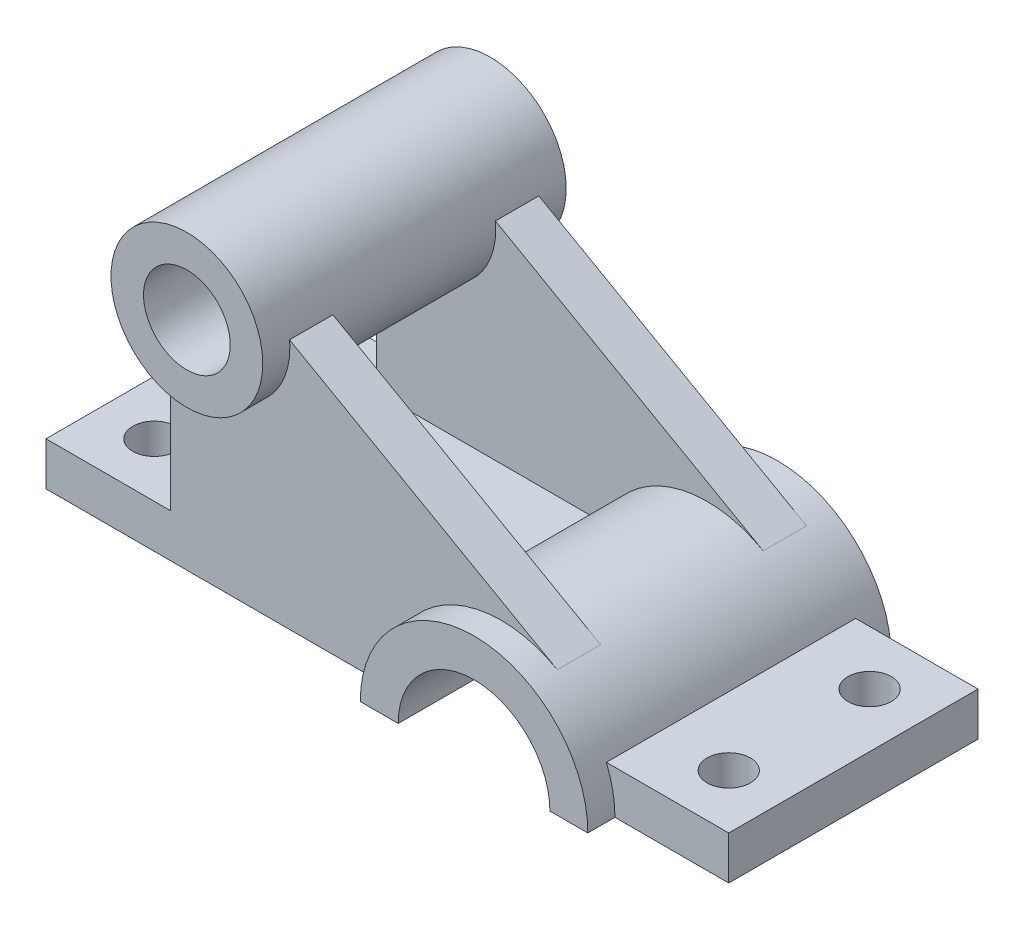
ISO-10303-21;
HEADER;
FILE_DESCRIPTION(('STEP AP214'),'2;1');
FILE_NAME('part.step','',(''),(''),'','','');
FILE_SCHEMA(('AUTOMOTIVE_DESIGN { 1 0 10303 214 1 1 1 1 }'));
ENDSEC;
DATA;
#1=APPLICATION_CONTEXT('core data for automotive mechanical design processes');
#2=APPLICATION_PROTOCOL_DEFINITION('international standard','automotive_design',2000,#1);
#3=PRODUCT_CONTEXT('',#1,'mechanical');
#4=PRODUCT('Part','Part','',(#3));
#5=PRODUCT_RELATED_PRODUCT_CATEGORY('part','',(#4));
#6=PRODUCT_DEFINITION_FORMATION('','',#4);
#7=PRODUCT_DEFINITION_CONTEXT('part definition',#1,'design');
#8=PRODUCT_DEFINITION('design','',#6,#7);
#9=PRODUCT_DEFINITION_SHAPE('','',#8);
#10=(LENGTH_UNIT() NAMED_UNIT(*) SI_UNIT(.MILLI.,.METRE.));
#11=(NAMED_UNIT(*) PLANE_ANGLE_UNIT() SI_UNIT($,.RADIAN.));
#12=(NAMED_UNIT(*) SI_UNIT($,.STERADIAN.) SOLID_ANGLE_UNIT());
#13=UNCERTAINTY_MEASURE_WITH_UNIT(LENGTH_MEASURE(1.E-05),#10,'distance_accuracy_value','');
#14=(GEOMETRIC_REPRESENTATION_CONTEXT(3) GLOBAL_UNCERTAINTY_ASSIGNED_CONTEXT((#13)) GLOBAL_UNIT_ASSIGNED_CONTEXT((#10,
#11,#12)) REPRESENTATION_CONTEXT('',''));
#15=CARTESIAN_POINT('',(0.,0.,0.));
#16=DIRECTION('',(0.,0.,1.));
#17=DIRECTION('',(1.,0.,0.));
#18=AXIS2_PLACEMENT_3D('',#15,#16,#17);
#19=CARTESIAN_POINT('',(-53.,45.,28.));
#20=DIRECTION('',(0.,0.,-1.));
#21=DIRECTION('',(-1.,0.,0.));
#22=AXIS2_PLACEMENT_3D('',#19,#20,#21);
#23=CYLINDRICAL_SURFACE('',#22,14.);
#24=CARTESIAN_POINT('',(-53.,45.,15.));
#25=DIRECTION('',(0.,0.,1.));
#26=DIRECTION('',(1.,0.,0.));
#27=AXIS2_PLACEMENT_3D('',#24,#25,#26);
#28=CIRCLE('',#27,14.);
#29=CARTESIAN_POINT('',(-61.,33.5108747069239,15.));
#30=VERTEX_POINT('',#29);
#31=CARTESIAN_POINT('',(-39.0597014509241,46.291540306236,15.));
#32=VERTEX_POINT('',#31);
#33=EDGE_CURVE('E383',#30,#32,#28,.T.);
#34=ORIENTED_EDGE('',*,*,#33,.F.);
#35=DIRECTION('',(0.,0.,-1.));
#36=VECTOR('',#35,1.);
#37=CARTESIAN_POINT('',(-61.,33.5108747069239,28.));
#38=LINE('',#37,#36);
#39=CARTESIAN_POINT('',(-61.,33.5108747069239,23.));
#40=VERTEX_POINT('',#39);
#41=EDGE_CURVE('E386',#30,#40,#38,.F.);
#42=ORIENTED_EDGE('',*,*,#41,.T.);
#43=CARTESIAN_POINT('',(-53.,45.,23.));
#44=DIRECTION('',(0.,0.,1.));
#45=DIRECTION('',(1.,0.,0.));
#46=AXIS2_PLACEMENT_3D('',#43,#44,#45);
#47=CIRCLE('',#46,14.);
#48=CARTESIAN_POINT('',(-39.0597014509241,46.291540306236,23.));
#49=VERTEX_POINT('',#48);
#50=EDGE_CURVE('E376',#40,#49,#47,.T.);
#51=ORIENTED_EDGE('',*,*,#50,.T.);
#52=DIRECTION('',(0.,0.,-1.));
#53=VECTOR('',#52,1.);
#54=CARTESIAN_POINT('',(-39.0597014509241,46.291540306236,28.));
#55=LINE('',#54,#53);
#56=EDGE_CURVE('E390',#49,#32,#55,.T.);
#57=ORIENTED_EDGE('',*,*,#56,.T.);
#58=EDGE_LOOP('',(#34,#42,#51,#57));
#59=FACE_BOUND('',#58,.T.);
#60=CARTESIAN_POINT('',(-53.,45.,28.));
#61=DIRECTION('',(0.,0.,1.));
#62=DIRECTION('',(1.,0.,0.));
#63=AXIS2_PLACEMENT_3D('',#60,#61,#62);
#64=CIRCLE('',#63,14.);
#65=CARTESIAN_POINT('',(-39.,45.,28.));
#66=VERTEX_POINT('',#65);
#67=EDGE_CURVE('E11',#66,#66,#64,.T.);
#68=ORIENTED_EDGE('',*,*,#67,.F.);
#69=EDGE_LOOP('',(#68));
#70=FACE_BOUND('',#69,.T.);
#71=CARTESIAN_POINT('',(-53.,45.,-28.));
#72=DIRECTION('',(0.,0.,1.));
#73=DIRECTION('',(1.,0.,0.));
#74=AXIS2_PLACEMENT_3D('',#71,#72,#73);
#75=CIRCLE('',#74,14.);
#76=CARTESIAN_POINT('',(-39.,45.,-28.));
#77=VERTEX_POINT('',#76);
#78=EDGE_CURVE('E48',#77,#77,#75,.T.);
#79=ORIENTED_EDGE('',*,*,#78,.T.);
#80=EDGE_LOOP('',(#79));
#81=FACE_BOUND('',#80,.T.);
#82=CARTESIAN_POINT('',(-53.,45.,-15.));
#83=DIRECTION('',(0.,0.,-1.));
#84=DIRECTION('',(-1.,0.,0.));
#85=AXIS2_PLACEMENT_3D('',#82,#83,#84);
#86=CIRCLE('',#85,14.);
#87=CARTESIAN_POINT('',(-39.0597014509241,46.291540306236,-15.));
#88=VERTEX_POINT('',#87);
#89=CARTESIAN_POINT('',(-61.,33.5108747069239,-15.));
#90=VERTEX_POINT('',#89);
#91=EDGE_CURVE('E227',#88,#90,#86,.T.);
#92=ORIENTED_EDGE('',*,*,#91,.F.);
#93=DIRECTION('',(0.,0.,-1.));
#94=VECTOR('',#93,1.);
#95=CARTESIAN_POINT('',(-39.0597014509241,46.291540306236,28.));
#96=LINE('',#95,#94);
#97=CARTESIAN_POINT('',(-39.0597014509241,46.291540306236,-23.));
#98=VERTEX_POINT('',#97);
#99=EDGE_CURVE('E232',#98,#88,#96,.F.);
#100=ORIENTED_EDGE('',*,*,#99,.F.);
#101=CARTESIAN_POINT('',(-53.,45.,-23.));
#102=DIRECTION('',(0.,0.,-1.));
#103=DIRECTION('',(-1.,0.,0.));
#104=AXIS2_PLACEMENT_3D('',#101,#102,#103);
#105=CIRCLE('',#104,14.);
#106=CARTESIAN_POINT('',(-61.,33.5108747069239,-23.));
#107=VERTEX_POINT('',#106);
#108=EDGE_CURVE('E202',#98,#107,#105,.T.);
#109=ORIENTED_EDGE('',*,*,#108,.T.);
#110=DIRECTION('',(0.,0.,-1.));
#111=VECTOR('',#110,1.);
#112=CARTESIAN_POINT('',(-61.,33.5108747069239,28.));
#113=LINE('',#112,#111);
#114=EDGE_CURVE('E206',#90,#107,#113,.T.);
#115=ORIENTED_EDGE('',*,*,#114,.F.);
#116=EDGE_LOOP('',(#92,#100,#109,#115));
#117=FACE_BOUND('',#116,.T.);
#118=ADVANCED_FACE('F45',(#59,#70,#81,#117),#23,.T.);
#119=CARTESIAN_POINT('',(0.,0.,28.));
#120=DIRECTION('',(0.,0.,-1.));
#121=DIRECTION('',(-1.,0.,0.));
#122=AXIS2_PLACEMENT_3D('',#119,#120,#121);
#123=CYLINDRICAL_SURFACE('',#122,21.);
#124=CARTESIAN_POINT('',(0.,0.,-15.));
#125=DIRECTION('',(0.,0.,-1.));
#126=DIRECTION('',(1.,0.,0.));
#127=AXIS2_PLACEMENT_3D('',#124,#125,#126);
#128=CIRCLE('',#127,21.);
#129=CARTESIAN_POINT('',(-19.4164878389476,7.99999999999999,-15.));
#130=VERTEX_POINT('',#129);
#131=CARTESIAN_POINT('',(10.3589699992719,18.2672313324758,-15.));
#132=VERTEX_POINT('',#131);
#133=EDGE_CURVE('E215',#130,#132,#128,.T.);
#134=ORIENTED_EDGE('',*,*,#133,.F.);
#135=DIRECTION('',(0.,0.,-1.));
#136=VECTOR('',#135,1.);
#137=CARTESIAN_POINT('',(-19.4164878389476,7.99999999999999,28.));
#138=LINE('',#137,#136);
#139=CARTESIAN_POINT('',(-19.4164878389476,7.99999999999999,15.));
#140=VERTEX_POINT('',#139);
#141=EDGE_CURVE('E333',#140,#130,#138,.T.);
#142=ORIENTED_EDGE('',*,*,#141,.F.);
#143=CARTESIAN_POINT('',(0.,0.,15.));
#144=DIRECTION('',(0.,0.,-1.));
#145=DIRECTION('',(1.,0.,0.));
#146=AXIS2_PLACEMENT_3D('',#143,#144,#145);
#147=CIRCLE('',#146,21.);
#148=CARTESIAN_POINT('',(10.3589699992719,18.2672313324758,15.));
#149=VERTEX_POINT('',#148);
#150=EDGE_CURVE('E356',#140,#149,#147,.T.);
#151=ORIENTED_EDGE('',*,*,#150,.T.);
#152=DIRECTION('',(0.,0.,1.));
#153=VECTOR('',#152,1.);
#154=CARTESIAN_POINT('',(10.3589699992719,18.2672313324758,15.));
#155=LINE('',#154,#153);
#156=CARTESIAN_POINT('',(10.3589699992719,18.2672313324758,23.));
#157=VERTEX_POINT('',#156);
#158=EDGE_CURVE('E373',#149,#157,#155,.T.);
#159=ORIENTED_EDGE('',*,*,#158,.T.);
#160=CARTESIAN_POINT('',(0.,0.,23.));
#161=DIRECTION('',(0.,0.,-1.));
#162=DIRECTION('',(1.,0.,0.));
#163=AXIS2_PLACEMENT_3D('',#160,#161,#162);
#164=CIRCLE('',#163,21.);
#165=CARTESIAN_POINT('',(-21.,0.,23.));
#166=VERTEX_POINT('',#165);
#167=EDGE_CURVE('E367',#166,#157,#164,.T.);
#168=ORIENTED_EDGE('',*,*,#167,.F.);
#169=DIRECTION('',(0.,0.,-1.));
#170=VECTOR('',#169,1.);
#171=CARTESIAN_POINT('',(-21.,0.,28.));
#172=LINE('',#171,#170);
#173=CARTESIAN_POINT('',(-21.,0.,28.));
#174=VERTEX_POINT('',#173);
#175=EDGE_CURVE('E322',#174,#166,#172,.T.);
#176=ORIENTED_EDGE('',*,*,#175,.F.);
#177=CARTESIAN_POINT('',(0.,0.,28.));
#178=DIRECTION('',(0.,0.,1.));
#179=DIRECTION('',(1.,0.,0.));
#180=AXIS2_PLACEMENT_3D('',#177,#178,#179);
#181=CIRCLE('',#180,21.);
#182=CARTESIAN_POINT('',(21.,0.,28.));
#183=VERTEX_POINT('',#182);
#184=EDGE_CURVE('E298',#183,#174,#181,.T.);
#185=ORIENTED_EDGE('',*,*,#184,.F.);
#186=DIRECTION('',(0.,0.,-1.));
#187=VECTOR('',#186,1.);
#188=CARTESIAN_POINT('',(21.,0.,28.));
#189=LINE('',#188,#187);
#190=CARTESIAN_POINT('',(21.,0.,23.));
#191=VERTEX_POINT('',#190);
#192=EDGE_CURVE('E327',#183,#191,#189,.T.);
#193=ORIENTED_EDGE('',*,*,#192,.T.);
#194=CARTESIAN_POINT('',(0.,0.,23.));
#195=DIRECTION('',(0.,0.,1.));
#196=DIRECTION('',(1.,0.,0.));
#197=AXIS2_PLACEMENT_3D('',#194,#195,#196);
#198=CIRCLE('',#197,21.);
#199=CARTESIAN_POINT('',(19.4164878389476,8.,23.));
#200=VERTEX_POINT('',#199);
#201=EDGE_CURVE('E344',#191,#200,#198,.T.);
#202=ORIENTED_EDGE('',*,*,#201,.T.);
#203=DIRECTION('',(0.,0.,-1.));
#204=VECTOR('',#203,1.);
#205=CARTESIAN_POINT('',(19.4164878389476,8.,28.));
#206=LINE('',#205,#204);
#207=CARTESIAN_POINT('',(19.4164878389476,8.,-23.));
#208=VERTEX_POINT('',#207);
#209=EDGE_CURVE('E340',#208,#200,#206,.F.);
#210=ORIENTED_EDGE('',*,*,#209,.F.);
#211=CARTESIAN_POINT('',(0.,0.,-23.));
#212=DIRECTION('',(0.,0.,1.));
#213=DIRECTION('',(1.,0.,0.));
#214=AXIS2_PLACEMENT_3D('',#211,#212,#213);
#215=CIRCLE('',#214,21.);
#216=CARTESIAN_POINT('',(21.,0.,-23.));
#217=VERTEX_POINT('',#216);
#218=EDGE_CURVE('E336',#217,#208,#215,.T.);
#219=ORIENTED_EDGE('',*,*,#218,.F.);
#220=CARTESIAN_POINT('',(21.,0.,-28.));
#221=VERTEX_POINT('',#220);
#222=EDGE_CURVE('E326',#217,#221,#189,.T.);
#223=ORIENTED_EDGE('',*,*,#222,.T.);
#224=CARTESIAN_POINT('',(0.,0.,-28.));
#225=DIRECTION('',(0.,0.,1.));
#226=DIRECTION('',(1.,0.,0.));
#227=AXIS2_PLACEMENT_3D('',#224,#225,#226);
#228=CIRCLE('',#227,21.);
#229=CARTESIAN_POINT('',(-21.,0.,-28.));
#230=VERTEX_POINT('',#229);
#231=EDGE_CURVE('E312',#221,#230,#228,.T.);
#232=ORIENTED_EDGE('',*,*,#231,.T.);
#233=CARTESIAN_POINT('',(-21.,0.,-23.));
#234=VERTEX_POINT('',#233);
#235=EDGE_CURVE('E321',#234,#230,#172,.T.);
#236=ORIENTED_EDGE('',*,*,#235,.F.);
#237=CARTESIAN_POINT('',(0.,0.,-23.));
#238=DIRECTION('',(0.,0.,1.));
#239=DIRECTION('',(1.,0.,0.));
#240=AXIS2_PLACEMENT_3D('',#237,#238,#239);
#241=CIRCLE('',#240,21.);
#242=CARTESIAN_POINT('',(10.3589699992719,18.2672313324758,-23.));
#243=VERTEX_POINT('',#242);
#244=EDGE_CURVE('E261',#243,#234,#241,.T.);
#245=ORIENTED_EDGE('',*,*,#244,.F.);
#246=DIRECTION('',(0.,0.,-1.));
#247=VECTOR('',#246,1.);
#248=CARTESIAN_POINT('',(10.3589699992719,18.2672313324758,-15.));
#249=LINE('',#248,#247);
#250=EDGE_CURVE('E68',#132,#243,#249,.T.);
#251=ORIENTED_EDGE('',*,*,#250,.F.);
#252=EDGE_LOOP('',(#134,#142,#151,#159,#168,#176,#185,#193,#202,#210,#219,#223,#232,#236,#245,#251));
#253=FACE_BOUND('',#252,.T.);
#254=ADVANCED_FACE('F424',(#253),#123,.T.);
#255=CARTESIAN_POINT('',(-11.4891252930761,7.99999999999999,23.));
#256=DIRECTION('',(0.,-1.,0.));
#257=DIRECTION('',(1.,0.,0.));
#258=AXIS2_PLACEMENT_3D('',#255,#256,#257);
#259=PLANE('',#258);
#260=CARTESIAN_POINT('',(-74.,7.99999999999999,13.));
#261=DIRECTION('',(0.,1.,0.));
#262=DIRECTION('',(0.,0.,1.));
#263=AXIS2_PLACEMENT_3D('',#260,#261,#262);
#264=CIRCLE('',#263,4.00000000000002);
#265=CARTESIAN_POINT('',(-74.,7.99999999999999,17.));
#266=VERTEX_POINT('',#265);
#267=EDGE_CURVE('E475',#266,#266,#264,.T.);
#268=ORIENTED_EDGE('',*,*,#267,.F.);
#269=EDGE_LOOP('',(#268));
#270=FACE_BOUND('',#269,.T.);
#271=CARTESIAN_POINT('',(-74.,7.99999999999999,-13.));
#272=DIRECTION('',(0.,1.,0.));
#273=DIRECTION('',(0.,0.,1.));
#274=AXIS2_PLACEMENT_3D('',#271,#272,#273);
#275=CIRCLE('',#274,4.00000000000002);
#276=CARTESIAN_POINT('',(-74.,7.99999999999999,-8.99999999999997));
#277=VERTEX_POINT('',#276);
#278=EDGE_CURVE('E467',#277,#277,#275,.T.);
#279=ORIENTED_EDGE('',*,*,#278,.F.);
#280=EDGE_LOOP('',(#279));
#281=FACE_BOUND('',#280,.T.);
#282=DIRECTION('',(0.,0.,-1.));
#283=VECTOR('',#282,1.);
#284=CARTESIAN_POINT('',(-61.,7.99999999999999,-15.));
#285=LINE('',#284,#283);
#286=CARTESIAN_POINT('',(-61.,7.99999999999999,-15.));
#287=VERTEX_POINT('',#286);
#288=CARTESIAN_POINT('',(-61.,7.99999999999999,-23.));
#289=VERTEX_POINT('',#288);
#290=EDGE_CURVE('E193',#287,#289,#285,.T.);
#291=ORIENTED_EDGE('',*,*,#290,.T.);
#292=DIRECTION('',(-1.,0.,0.));
#293=VECTOR('',#292,1.);
#294=CARTESIAN_POINT('',(-11.4891252930761,7.99999999999999,-23.));
#295=LINE('',#294,#293);
#296=CARTESIAN_POINT('',(-84.,7.99999999999998,-23.));
#297=VERTEX_POINT('',#296);
#298=EDGE_CURVE('E180',#289,#297,#295,.T.);
#299=ORIENTED_EDGE('',*,*,#298,.T.);
#300=DIRECTION('',(0.,0.,-1.));
#301=VECTOR('',#300,1.);
#302=CARTESIAN_POINT('',(-84.,7.99999999999998,23.));
#303=LINE('',#302,#301);
#304=CARTESIAN_POINT('',(-84.,7.99999999999998,23.));
#305=VERTEX_POINT('',#304);
#306=EDGE_CURVE('E268',#305,#297,#303,.T.);
#307=ORIENTED_EDGE('',*,*,#306,.F.);
#308=DIRECTION('',(-1.,0.,0.));
#309=VECTOR('',#308,1.);
#310=CARTESIAN_POINT('',(-11.4891252930761,7.99999999999999,23.));
#311=LINE('',#310,#309);
#312=CARTESIAN_POINT('',(-61.,7.99999999999999,23.));
#313=VERTEX_POINT('',#312);
#314=EDGE_CURVE('E270',#313,#305,#311,.T.);
#315=ORIENTED_EDGE('',*,*,#314,.F.);
#316=DIRECTION('',(0.,0.,1.));
#317=VECTOR('',#316,1.);
#318=CARTESIAN_POINT('',(-61.,7.99999999999999,15.));
#319=LINE('',#318,#317);
#320=CARTESIAN_POINT('',(-61.,7.99999999999999,15.));
#321=VERTEX_POINT('',#320);
#322=EDGE_CURVE('E363',#321,#313,#319,.T.);
#323=ORIENTED_EDGE('',*,*,#322,.F.);
#324=DIRECTION('',(1.,0.,0.));
#325=VECTOR('',#324,1.);
#326=CARTESIAN_POINT('',(-19.4164878389476,7.99999999999999,15.));
#327=LINE('',#326,#325);
#328=EDGE_CURVE('E352',#321,#140,#327,.T.);
#329=ORIENTED_EDGE('',*,*,#328,.T.);
#330=ORIENTED_EDGE('',*,*,#141,.T.);
#331=DIRECTION('',(1.,0.,0.));
#332=VECTOR('',#331,1.);
#333=CARTESIAN_POINT('',(-19.4164878389476,7.99999999999999,-15.));
#334=LINE('',#333,#332);
#335=EDGE_CURVE('E197',#287,#130,#334,.T.);
#336=ORIENTED_EDGE('',*,*,#335,.F.);
#337=EDGE_LOOP('',(#291,#299,#307,#315,#323,#329,#330,#336));
#338=FACE_BOUND('',#337,.T.);
#339=ADVANCED_FACE('F194',(#270,#281,#338),#259,.F.);
#340=CARTESIAN_POINT('',(-53.,45.,28.));
#341=DIRECTION('',(0.,0.,1.));
#342=DIRECTION('',(1.,0.,0.));
#343=AXIS2_PLACEMENT_3D('',#340,#341,#342);
#344=PLANE('',#343);
#345=ORIENTED_EDGE('',*,*,#67,.T.);
#346=EDGE_LOOP('',(#345));
#347=FACE_BOUND('',#346,.T.);
#348=CARTESIAN_POINT('',(-53.,45.,28.));
#349=DIRECTION('',(0.,0.,1.));
#350=DIRECTION('',(1.,0.,0.));
#351=AXIS2_PLACEMENT_3D('',#348,#349,#350);
#352=CIRCLE('',#351,8.);
#353=CARTESIAN_POINT('',(-45.,45.,28.));
#354=VERTEX_POINT('',#353);
#355=EDGE_CURVE('E395',#354,#354,#352,.T.);
#356=ORIENTED_EDGE('',*,*,#355,.F.);
#357=EDGE_LOOP('',(#356));
#358=FACE_BOUND('',#357,.T.);
#359=ADVANCED_FACE('F419',(#347,#358),#344,.T.);
#360=CARTESIAN_POINT('',(-53.,45.,-28.));
#361=DIRECTION('',(0.,0.,1.));
#362=DIRECTION('',(1.,0.,0.));
#363=AXIS2_PLACEMENT_3D('',#360,#361,#362);
#364=PLANE('',#363);
#365=ORIENTED_EDGE('',*,*,#78,.F.);
#366=EDGE_LOOP('',(#365));
#367=FACE_BOUND('',#366,.T.);
#368=CARTESIAN_POINT('',(-53.,45.,-28.));
#369=DIRECTION('',(0.,0.,1.));
#370=DIRECTION('',(1.,0.,0.));
#371=AXIS2_PLACEMENT_3D('',#368,#369,#370);
#372=CIRCLE('',#371,8.);
#373=CARTESIAN_POINT('',(-45.,45.,-28.));
#374=VERTEX_POINT('',#373);
#375=EDGE_CURVE('E394',#374,#374,#372,.T.);
#376=ORIENTED_EDGE('',*,*,#375,.T.);
#377=EDGE_LOOP('',(#376));
#378=FACE_BOUND('',#377,.T.);
#379=ADVANCED_FACE('F403',(#367,#378),#364,.F.);
#380=CARTESIAN_POINT('',(-53.,45.,28.));
#381=DIRECTION('',(0.,0.,-1.));
#382=DIRECTION('',(-1.,0.,0.));
#383=AXIS2_PLACEMENT_3D('',#380,#381,#382);
#384=CYLINDRICAL_SURFACE('',#383,8.);
#385=ORIENTED_EDGE('',*,*,#355,.T.);
#386=EDGE_LOOP('',(#385));
#387=FACE_BOUND('',#386,.T.);
#388=ORIENTED_EDGE('',*,*,#375,.F.);
#389=EDGE_LOOP('',(#388));
#390=FACE_BOUND('',#389,.T.);
#391=ADVANCED_FACE('F405',(#387,#390),#384,.F.);
#392=CARTESIAN_POINT('',(-49.0537257145631,51.9589452695146,15.));
#393=DIRECTION('',(0.493284285679614,0.869868158689323,0.));
#394=DIRECTION('',(-0.869868158689323,0.493284285679614,0.));
#395=AXIS2_PLACEMENT_3D('',#392,#393,#394);
#396=PLANE('',#395);
#397=ORIENTED_EDGE('',*,*,#56,.F.);
#398=DIRECTION('',(-0.869868158689323,0.493284285679614,0.));
#399=VECTOR('',#398,1.);
#400=CARTESIAN_POINT('',(-49.0537257145631,51.9589452695146,23.));
#401=LINE('',#400,#399);
#402=EDGE_CURVE('E353',#157,#49,#401,.T.);
#403=ORIENTED_EDGE('',*,*,#402,.F.);
#404=ORIENTED_EDGE('',*,*,#158,.F.);
#405=DIRECTION('',(-0.869868158689323,0.493284285679614,0.));
#406=VECTOR('',#405,1.);
#407=CARTESIAN_POINT('',(-49.0537257145631,51.9589452695146,15.));
#408=LINE('',#407,#406);
#409=EDGE_CURVE('E359',#149,#32,#408,.T.);
#410=ORIENTED_EDGE('',*,*,#409,.T.);
#411=EDGE_LOOP('',(#397,#403,#404,#410));
#412=FACE_BOUND('',#411,.T.);
#413=ADVANCED_FACE('F407',(#412),#396,.T.);
#414=CARTESIAN_POINT('',(-61.,45.,15.));
#415=DIRECTION('',(-1.,0.,0.));
#416=DIRECTION('',(0.,0.,1.));
#417=AXIS2_PLACEMENT_3D('',#414,#415,#416);
#418=PLANE('',#417);
#419=ORIENTED_EDGE('',*,*,#41,.F.);
#420=DIRECTION('',(0.,-1.,0.));
#421=VECTOR('',#420,1.);
#422=CARTESIAN_POINT('',(-61.,45.,15.));
#423=LINE('',#422,#421);
#424=EDGE_CURVE('E348',#30,#321,#423,.T.);
#425=ORIENTED_EDGE('',*,*,#424,.T.);
#426=ORIENTED_EDGE('',*,*,#322,.T.);
#427=DIRECTION('',(0.,-1.,0.));
#428=VECTOR('',#427,1.);
#429=CARTESIAN_POINT('',(-61.,45.,23.));
#430=LINE('',#429,#428);
#431=EDGE_CURVE('E347',#40,#313,#430,.T.);
#432=ORIENTED_EDGE('',*,*,#431,.F.);
#433=EDGE_LOOP('',(#419,#425,#426,#432));
#434=FACE_BOUND('',#433,.T.);
#435=ADVANCED_FACE('F415',(#434),#418,.T.);
#436=CARTESIAN_POINT('',(-53.,45.,15.));
#437=DIRECTION('',(0.,0.,1.));
#438=DIRECTION('',(1.,0.,0.));
#439=AXIS2_PLACEMENT_3D('',#436,#437,#438);
#440=PLANE('',#439);
#441=ORIENTED_EDGE('',*,*,#424,.F.);
#442=ORIENTED_EDGE('',*,*,#33,.T.);
#443=ORIENTED_EDGE('',*,*,#409,.F.);
#444=ORIENTED_EDGE('',*,*,#150,.F.);
#445=ORIENTED_EDGE('',*,*,#328,.F.);
#446=EDGE_LOOP('',(#441,#442,#443,#444,#445));
#447=FACE_BOUND('',#446,.T.);
#448=ADVANCED_FACE('F555',(#447),#440,.F.);
#449=CARTESIAN_POINT('',(-53.,45.,23.));
#450=DIRECTION('',(0.,0.,1.));
#451=DIRECTION('',(1.,0.,0.));
#452=AXIS2_PLACEMENT_3D('',#449,#450,#451);
#453=PLANE('',#452);
#454=ORIENTED_EDGE('',*,*,#50,.F.);
#455=ORIENTED_EDGE('',*,*,#431,.T.);
#456=ORIENTED_EDGE('',*,*,#314,.T.);
#457=DIRECTION('',(0.,-1.,0.));
#458=VECTOR('',#457,1.);
#459=CARTESIAN_POINT('',(-84.,7.99999999999998,23.));
#460=LINE('',#459,#458);
#461=CARTESIAN_POINT('',(-84.,0.,23.));
#462=VERTEX_POINT('',#461);
#463=EDGE_CURVE('E190',#305,#462,#460,.T.);
#464=ORIENTED_EDGE('',*,*,#463,.T.);
#465=DIRECTION('',(1.,0.,0.));
#466=VECTOR('',#465,1.);
#467=CARTESIAN_POINT('',(-84.,0.,23.));
#468=LINE('',#467,#466);
#469=EDGE_CURVE('E279',#462,#166,#468,.T.);
#470=ORIENTED_EDGE('',*,*,#469,.T.);
#471=ORIENTED_EDGE('',*,*,#167,.T.);
#472=ORIENTED_EDGE('',*,*,#402,.T.);
#473=EDGE_LOOP('',(#454,#455,#456,#464,#470,#471,#472));
#474=FACE_BOUND('',#473,.T.);
#475=ADVANCED_FACE('F553',(#474),#453,.T.);
#476=CARTESIAN_POINT('',(0.,0.,28.));
#477=DIRECTION('',(0.,0.,-1.));
#478=DIRECTION('',(-1.,0.,0.));
#479=AXIS2_PLACEMENT_3D('',#476,#477,#478);
#480=CYLINDRICAL_SURFACE('',#479,14.);
#481=CARTESIAN_POINT('',(0.,0.,-28.));
#482=DIRECTION('',(0.,0.,-1.));
#483=DIRECTION('',(1.,0.,0.));
#484=AXIS2_PLACEMENT_3D('',#481,#482,#483);
#485=CIRCLE('',#484,14.);
#486=CARTESIAN_POINT('',(-14.,0.,-28.));
#487=VERTEX_POINT('',#486);
#488=CARTESIAN_POINT('',(14.,0.,-28.));
#489=VERTEX_POINT('',#488);
#490=EDGE_CURVE('E289',#487,#489,#485,.T.);
#491=ORIENTED_EDGE('',*,*,#490,.T.);
#492=DIRECTION('',(0.,0.,-1.));
#493=VECTOR('',#492,1.);
#494=CARTESIAN_POINT('',(14.,0.,28.));
#495=LINE('',#494,#493);
#496=CARTESIAN_POINT('',(14.,0.,28.));
#497=VERTEX_POINT('',#496);
#498=EDGE_CURVE('E330',#497,#489,#495,.T.);
#499=ORIENTED_EDGE('',*,*,#498,.F.);
#500=CARTESIAN_POINT('',(0.,0.,28.));
#501=DIRECTION('',(0.,0.,-1.));
#502=DIRECTION('',(1.,0.,0.));
#503=AXIS2_PLACEMENT_3D('',#500,#501,#502);
#504=CIRCLE('',#503,14.);
#505=CARTESIAN_POINT('',(-14.,0.,28.));
#506=VERTEX_POINT('',#505);
#507=EDGE_CURVE('E290',#506,#497,#504,.T.);
#508=ORIENTED_EDGE('',*,*,#507,.F.);
#509=DIRECTION('',(0.,0.,-1.));
#510=VECTOR('',#509,1.);
#511=CARTESIAN_POINT('',(-14.,0.,28.));
#512=LINE('',#511,#510);
#513=EDGE_CURVE('E304',#506,#487,#512,.T.);
#514=ORIENTED_EDGE('',*,*,#513,.T.);
#515=EDGE_LOOP('',(#491,#499,#508,#514));
#516=FACE_BOUND('',#515,.T.);
#517=ADVANCED_FACE('F549',(#516),#480,.F.);
#518=CARTESIAN_POINT('',(14.,0.,28.));
#519=DIRECTION('',(0.,1.,0.));
#520=DIRECTION('',(0.,0.,1.));
#521=AXIS2_PLACEMENT_3D('',#518,#519,#520);
#522=PLANE('',#521);
#523=CARTESIAN_POINT('',(32.,0.,-13.));
#524=DIRECTION('',(0.,1.,0.));
#525=DIRECTION('',(0.,0.,1.));
#526=AXIS2_PLACEMENT_3D('',#523,#524,#525);
#527=CIRCLE('',#526,4.00000000000002);
#528=CARTESIAN_POINT('',(32.,0.,-8.99999999999998));
#529=VERTEX_POINT('',#528);
#530=EDGE_CURVE('E455',#529,#529,#527,.T.);
#531=ORIENTED_EDGE('',*,*,#530,.T.);
#532=EDGE_LOOP('',(#531));
#533=FACE_BOUND('',#532,.T.);
#534=CARTESIAN_POINT('',(32.,0.,13.));
#535=DIRECTION('',(0.,1.,0.));
#536=DIRECTION('',(0.,0.,1.));
#537=AXIS2_PLACEMENT_3D('',#534,#535,#536);
#538=CIRCLE('',#537,4.00000000000002);
#539=CARTESIAN_POINT('',(32.,0.,17.));
#540=VERTEX_POINT('',#539);
#541=EDGE_CURVE('E218',#540,#540,#538,.T.);
#542=ORIENTED_EDGE('',*,*,#541,.T.);
#543=EDGE_LOOP('',(#542));
#544=FACE_BOUND('',#543,.T.);
#545=ORIENTED_EDGE('',*,*,#498,.T.);
#546=DIRECTION('',(1.,0.,0.));
#547=VECTOR('',#546,1.);
#548=CARTESIAN_POINT('',(14.,0.,-28.));
#549=LINE('',#548,#547);
#550=EDGE_CURVE('E308',#489,#221,#549,.T.);
#551=ORIENTED_EDGE('',*,*,#550,.T.);
#552=ORIENTED_EDGE('',*,*,#222,.F.);
#553=DIRECTION('',(1.,0.,0.));
#554=VECTOR('',#553,1.);
#555=CARTESIAN_POINT('',(14.,0.,-23.));
#556=LINE('',#555,#554);
#557=CARTESIAN_POINT('',(42.,0.,-23.));
#558=VERTEX_POINT('',#557);
#559=EDGE_CURVE('E241',#217,#558,#556,.T.);
#560=ORIENTED_EDGE('',*,*,#559,.T.);
#561=DIRECTION('',(0.,0.,-1.));
#562=VECTOR('',#561,1.);
#563=CARTESIAN_POINT('',(42.,0.,23.));
#564=LINE('',#563,#562);
#565=CARTESIAN_POINT('',(42.,0.,23.));
#566=VERTEX_POINT('',#565);
#567=EDGE_CURVE('E257',#566,#558,#564,.T.);
#568=ORIENTED_EDGE('',*,*,#567,.F.);
#569=DIRECTION('',(1.,0.,0.));
#570=VECTOR('',#569,1.);
#571=CARTESIAN_POINT('',(14.,0.,23.));
#572=LINE('',#571,#570);
#573=EDGE_CURVE('E244',#191,#566,#572,.T.);
#574=ORIENTED_EDGE('',*,*,#573,.F.);
#575=ORIENTED_EDGE('',*,*,#192,.F.);
#576=DIRECTION('',(1.,0.,0.));
#577=VECTOR('',#576,1.);
#578=CARTESIAN_POINT('',(14.,0.,28.));
#579=LINE('',#578,#577);
#580=EDGE_CURVE('E294',#497,#183,#579,.T.);
#581=ORIENTED_EDGE('',*,*,#580,.F.);
#582=EDGE_LOOP('',(#545,#551,#552,#560,#568,#574,#575,#581));
#583=FACE_BOUND('',#582,.T.);
#584=ADVANCED_FACE('F544',(#533,#544,#583),#522,.F.);
#585=CARTESIAN_POINT('',(-21.,0.,28.));
#586=DIRECTION('',(0.,1.,0.));
#587=DIRECTION('',(0.,0.,1.));
#588=AXIS2_PLACEMENT_3D('',#585,#586,#587);
#589=PLANE('',#588);
#590=CARTESIAN_POINT('',(-74.,0.,13.));
#591=DIRECTION('',(0.,1.,0.));
#592=DIRECTION('',(0.,0.,1.));
#593=AXIS2_PLACEMENT_3D('',#590,#591,#592);
#594=CIRCLE('',#593,4.00000000000002);
#595=CARTESIAN_POINT('',(-74.,0.,17.));
#596=VERTEX_POINT('',#595);
#597=EDGE_CURVE('E471',#596,#596,#594,.T.);
#598=ORIENTED_EDGE('',*,*,#597,.T.);
#599=EDGE_LOOP('',(#598));
#600=FACE_BOUND('',#599,.T.);
#601=CARTESIAN_POINT('',(-74.,0.,-13.));
#602=DIRECTION('',(0.,1.,0.));
#603=DIRECTION('',(0.,0.,1.));
#604=AXIS2_PLACEMENT_3D('',#601,#602,#603);
#605=CIRCLE('',#604,4.00000000000002);
#606=CARTESIAN_POINT('',(-74.,0.,-8.99999999999997));
#607=VERTEX_POINT('',#606);
#608=EDGE_CURVE('E463',#607,#607,#605,.T.);
#609=ORIENTED_EDGE('',*,*,#608,.T.);
#610=EDGE_LOOP('',(#609));
#611=FACE_BOUND('',#610,.T.);
#612=ORIENTED_EDGE('',*,*,#175,.T.);
#613=ORIENTED_EDGE('',*,*,#469,.F.);
#614=DIRECTION('',(0.,0.,-1.));
#615=VECTOR('',#614,1.);
#616=CARTESIAN_POINT('',(-84.,0.,23.));
#617=LINE('',#616,#615);
#618=CARTESIAN_POINT('',(-84.,0.,-23.));
#619=VERTEX_POINT('',#618);
#620=EDGE_CURVE('E235',#462,#619,#617,.T.);
#621=ORIENTED_EDGE('',*,*,#620,.T.);
#622=DIRECTION('',(1.,0.,0.));
#623=VECTOR('',#622,1.);
#624=CARTESIAN_POINT('',(-84.,0.,-23.));
#625=LINE('',#624,#623);
#626=EDGE_CURVE('E189',#619,#234,#625,.T.);
#627=ORIENTED_EDGE('',*,*,#626,.T.);
#628=ORIENTED_EDGE('',*,*,#235,.T.);
#629=DIRECTION('',(1.,0.,0.));
#630=VECTOR('',#629,1.);
#631=CARTESIAN_POINT('',(-21.,0.,-28.));
#632=LINE('',#631,#630);
#633=EDGE_CURVE('E295',#230,#487,#632,.T.);
#634=ORIENTED_EDGE('',*,*,#633,.T.);
#635=ORIENTED_EDGE('',*,*,#513,.F.);
#636=DIRECTION('',(1.,0.,0.));
#637=VECTOR('',#636,1.);
#638=CARTESIAN_POINT('',(-21.,0.,28.));
#639=LINE('',#638,#637);
#640=EDGE_CURVE('E301',#174,#506,#639,.T.);
#641=ORIENTED_EDGE('',*,*,#640,.F.);
#642=EDGE_LOOP('',(#612,#613,#621,#627,#628,#634,#635,#641));
#643=FACE_BOUND('',#642,.T.);
#644=ADVANCED_FACE('F539',(#600,#611,#643),#589,.F.);
#645=CARTESIAN_POINT('',(0.,0.,28.));
#646=DIRECTION('',(0.,0.,1.));
#647=DIRECTION('',(1.,0.,0.));
#648=AXIS2_PLACEMENT_3D('',#645,#646,#647);
#649=PLANE('',#648);
#650=ORIENTED_EDGE('',*,*,#507,.T.);
#651=ORIENTED_EDGE('',*,*,#580,.T.);
#652=ORIENTED_EDGE('',*,*,#184,.T.);
#653=ORIENTED_EDGE('',*,*,#640,.T.);
#654=EDGE_LOOP('',(#650,#651,#652,#653));
#655=FACE_BOUND('',#654,.T.);
#656=ADVANCED_FACE('F536',(#655),#649,.T.);
#657=CARTESIAN_POINT('',(0.,0.,-28.));
#658=DIRECTION('',(0.,0.,1.));
#659=DIRECTION('',(1.,0.,0.));
#660=AXIS2_PLACEMENT_3D('',#657,#658,#659);
#661=PLANE('',#660);
#662=ORIENTED_EDGE('',*,*,#490,.F.);
#663=ORIENTED_EDGE('',*,*,#633,.F.);
#664=ORIENTED_EDGE('',*,*,#231,.F.);
#665=ORIENTED_EDGE('',*,*,#550,.F.);
#666=EDGE_LOOP('',(#662,#663,#664,#665));
#667=FACE_BOUND('',#666,.T.);
#668=ADVANCED_FACE('F535',(#667),#661,.F.);
#669=CARTESIAN_POINT('',(0.,0.,-23.));
#670=DIRECTION('',(0.,0.,1.));
#671=DIRECTION('',(1.,0.,0.));
#672=AXIS2_PLACEMENT_3D('',#669,#670,#671);
#673=PLANE('',#672);
#674=ORIENTED_EDGE('',*,*,#298,.F.);
#675=DIRECTION('',(0.,-1.,0.));
#676=VECTOR('',#675,1.);
#677=CARTESIAN_POINT('',(-61.,45.,-23.));
#678=LINE('',#677,#676);
#679=EDGE_CURVE('E60',#107,#289,#678,.T.);
#680=ORIENTED_EDGE('',*,*,#679,.F.);
#681=ORIENTED_EDGE('',*,*,#108,.F.);
#682=DIRECTION('',(-0.869868158689323,0.493284285679614,0.));
#683=VECTOR('',#682,1.);
#684=CARTESIAN_POINT('',(-49.0537257145631,51.9589452695146,-23.));
#685=LINE('',#684,#683);
#686=EDGE_CURVE('E210',#243,#98,#685,.T.);
#687=ORIENTED_EDGE('',*,*,#686,.F.);
#688=ORIENTED_EDGE('',*,*,#244,.T.);
#689=ORIENTED_EDGE('',*,*,#626,.F.);
#690=DIRECTION('',(0.,-1.,0.));
#691=VECTOR('',#690,1.);
#692=CARTESIAN_POINT('',(-84.,7.99999999999998,-23.));
#693=LINE('',#692,#691);
#694=EDGE_CURVE('E184',#297,#619,#693,.T.);
#695=ORIENTED_EDGE('',*,*,#694,.F.);
#696=EDGE_LOOP('',(#674,#680,#681,#687,#688,#689,#695));
#697=FACE_BOUND('',#696,.T.);
#698=ADVANCED_FACE('F182',(#697),#673,.F.);
#699=CARTESIAN_POINT('',(-84.,7.99999999999998,23.));
#700=DIRECTION('',(1.,0.,0.));
#701=DIRECTION('',(0.,0.,-1.));
#702=AXIS2_PLACEMENT_3D('',#699,#700,#701);
#703=PLANE('',#702);
#704=ORIENTED_EDGE('',*,*,#694,.T.);
#705=ORIENTED_EDGE('',*,*,#620,.F.);
#706=ORIENTED_EDGE('',*,*,#463,.F.);
#707=ORIENTED_EDGE('',*,*,#306,.T.);
#708=EDGE_LOOP('',(#704,#705,#706,#707));
#709=FACE_BOUND('',#708,.T.);
#710=ADVANCED_FACE('F529',(#709),#703,.F.);
#711=CARTESIAN_POINT('',(42.,8.,23.));
#712=DIRECTION('',(0.,-1.,0.));
#713=DIRECTION('',(1.,0.,0.));
#714=AXIS2_PLACEMENT_3D('',#711,#712,#713);
#715=PLANE('',#714);
#716=CARTESIAN_POINT('',(32.,8.,-13.));
#717=DIRECTION('',(0.,1.,0.));
#718=DIRECTION('',(0.,0.,1.));
#719=AXIS2_PLACEMENT_3D('',#716,#717,#718);
#720=CIRCLE('',#719,4.00000000000002);
#721=CARTESIAN_POINT('',(32.,8.,-8.99999999999998));
#722=VERTEX_POINT('',#721);
#723=EDGE_CURVE('E459',#722,#722,#720,.T.);
#724=ORIENTED_EDGE('',*,*,#723,.F.);
#725=EDGE_LOOP('',(#724));
#726=FACE_BOUND('',#725,.T.);
#727=CARTESIAN_POINT('',(32.,8.,13.));
#728=DIRECTION('',(0.,1.,0.));
#729=DIRECTION('',(0.,0.,1.));
#730=AXIS2_PLACEMENT_3D('',#727,#728,#729);
#731=CIRCLE('',#730,4.00000000000002);
#732=CARTESIAN_POINT('',(32.,8.,17.));
#733=VERTEX_POINT('',#732);
#734=EDGE_CURVE('E451',#733,#733,#731,.T.);
#735=ORIENTED_EDGE('',*,*,#734,.F.);
#736=EDGE_LOOP('',(#735));
#737=FACE_BOUND('',#736,.T.);
#738=DIRECTION('',(-1.,0.,0.));
#739=VECTOR('',#738,1.);
#740=CARTESIAN_POINT('',(42.,8.,-23.));
#741=LINE('',#740,#739);
#742=CARTESIAN_POINT('',(42.,8.,-23.));
#743=VERTEX_POINT('',#742);
#744=EDGE_CURVE('E248',#743,#208,#741,.T.);
#745=ORIENTED_EDGE('',*,*,#744,.T.);
#746=ORIENTED_EDGE('',*,*,#209,.T.);
#747=DIRECTION('',(-1.,0.,0.));
#748=VECTOR('',#747,1.);
#749=CARTESIAN_POINT('',(42.,8.,23.));
#750=LINE('',#749,#748);
#751=CARTESIAN_POINT('',(42.,8.,23.));
#752=VERTEX_POINT('',#751);
#753=EDGE_CURVE('E236',#752,#200,#750,.T.);
#754=ORIENTED_EDGE('',*,*,#753,.F.);
#755=DIRECTION('',(0.,0.,-1.));
#756=VECTOR('',#755,1.);
#757=CARTESIAN_POINT('',(42.,8.,23.));
#758=LINE('',#757,#756);
#759=EDGE_CURVE('E247',#752,#743,#758,.T.);
#760=ORIENTED_EDGE('',*,*,#759,.T.);
#761=EDGE_LOOP('',(#745,#746,#754,#760));
#762=FACE_BOUND('',#761,.T.);
#763=ADVANCED_FACE('F525',(#726,#737,#762),#715,.F.);
#764=CARTESIAN_POINT('',(42.,0.,23.));
#765=DIRECTION('',(-1.,0.,0.));
#766=DIRECTION('',(0.,0.,1.));
#767=AXIS2_PLACEMENT_3D('',#764,#765,#766);
#768=PLANE('',#767);
#769=DIRECTION('',(0.,1.,0.));
#770=VECTOR('',#769,1.);
#771=CARTESIAN_POINT('',(42.,0.,-23.));
#772=LINE('',#771,#770);
#773=EDGE_CURVE('E252',#558,#743,#772,.T.);
#774=ORIENTED_EDGE('',*,*,#773,.T.);
#775=ORIENTED_EDGE('',*,*,#759,.F.);
#776=DIRECTION('',(0.,1.,0.));
#777=VECTOR('',#776,1.);
#778=CARTESIAN_POINT('',(42.,0.,23.));
#779=LINE('',#778,#777);
#780=EDGE_CURVE('E240',#566,#752,#779,.T.);
#781=ORIENTED_EDGE('',*,*,#780,.F.);
#782=ORIENTED_EDGE('',*,*,#567,.T.);
#783=EDGE_LOOP('',(#774,#775,#781,#782));
#784=FACE_BOUND('',#783,.T.);
#785=ADVANCED_FACE('F519',(#784),#768,.F.);
#786=CARTESIAN_POINT('',(0.,0.,23.));
#787=DIRECTION('',(0.,0.,1.));
#788=DIRECTION('',(1.,0.,0.));
#789=AXIS2_PLACEMENT_3D('',#786,#787,#788);
#790=PLANE('',#789);
#791=ORIENTED_EDGE('',*,*,#201,.F.);
#792=ORIENTED_EDGE('',*,*,#573,.T.);
#793=ORIENTED_EDGE('',*,*,#780,.T.);
#794=ORIENTED_EDGE('',*,*,#753,.T.);
#795=EDGE_LOOP('',(#791,#792,#793,#794));
#796=FACE_BOUND('',#795,.T.);
#797=ADVANCED_FACE('F516',(#796),#790,.T.);
#798=CARTESIAN_POINT('',(0.,0.,-23.));
#799=DIRECTION('',(0.,0.,1.));
#800=DIRECTION('',(1.,0.,0.));
#801=AXIS2_PLACEMENT_3D('',#798,#799,#800);
#802=PLANE('',#801);
#803=ORIENTED_EDGE('',*,*,#559,.F.);
#804=ORIENTED_EDGE('',*,*,#218,.T.);
#805=ORIENTED_EDGE('',*,*,#744,.F.);
#806=ORIENTED_EDGE('',*,*,#773,.F.);
#807=EDGE_LOOP('',(#803,#804,#805,#806));
#808=FACE_BOUND('',#807,.T.);
#809=ADVANCED_FACE('F514',(#808),#802,.F.);
#810=CARTESIAN_POINT('',(-49.0537257145631,51.9589452695146,-15.));
#811=DIRECTION('',(-0.493284285679614,-0.869868158689323,0.));
#812=DIRECTION('',(0.869868158689323,-0.493284285679614,0.));
#813=AXIS2_PLACEMENT_3D('',#810,#811,#812);
#814=PLANE('',#813);
#815=ORIENTED_EDGE('',*,*,#686,.T.);
#816=ORIENTED_EDGE('',*,*,#99,.T.);
#817=DIRECTION('',(-0.869868158689323,0.493284285679614,0.));
#818=VECTOR('',#817,1.);
#819=CARTESIAN_POINT('',(-49.0537257145631,51.9589452695146,-15.));
#820=LINE('',#819,#818);
#821=EDGE_CURVE('E209',#132,#88,#820,.T.);
#822=ORIENTED_EDGE('',*,*,#821,.F.);
#823=ORIENTED_EDGE('',*,*,#250,.T.);
#824=EDGE_LOOP('',(#815,#816,#822,#823));
#825=FACE_BOUND('',#824,.T.);
#826=ADVANCED_FACE('F511',(#825),#814,.F.);
#827=CARTESIAN_POINT('',(-61.,45.,-15.));
#828=DIRECTION('',(1.,0.,0.));
#829=DIRECTION('',(0.,0.,-1.));
#830=AXIS2_PLACEMENT_3D('',#827,#828,#829);
#831=PLANE('',#830);
#832=DIRECTION('',(0.,-1.,0.));
#833=VECTOR('',#832,1.);
#834=CARTESIAN_POINT('',(-61.,45.,-15.));
#835=LINE('',#834,#833);
#836=EDGE_CURVE('E224',#90,#287,#835,.T.);
#837=ORIENTED_EDGE('',*,*,#836,.F.);
#838=ORIENTED_EDGE('',*,*,#114,.T.);
#839=ORIENTED_EDGE('',*,*,#679,.T.);
#840=ORIENTED_EDGE('',*,*,#290,.F.);
#841=EDGE_LOOP('',(#837,#838,#839,#840));
#842=FACE_BOUND('',#841,.T.);
#843=ADVANCED_FACE('F204',(#842),#831,.F.);
#844=CARTESIAN_POINT('',(-53.,45.,-15.));
#845=DIRECTION('',(0.,0.,-1.));
#846=DIRECTION('',(1.,0.,0.));
#847=AXIS2_PLACEMENT_3D('',#844,#845,#846);
#848=PLANE('',#847);
#849=ORIENTED_EDGE('',*,*,#821,.T.);
#850=ORIENTED_EDGE('',*,*,#91,.T.);
#851=ORIENTED_EDGE('',*,*,#836,.T.);
#852=ORIENTED_EDGE('',*,*,#335,.T.);
#853=ORIENTED_EDGE('',*,*,#133,.T.);
#854=EDGE_LOOP('',(#849,#850,#851,#852,#853));
#855=FACE_BOUND('',#854,.T.);
#856=ADVANCED_FACE('F440',(#855),#848,.F.);
#857=CARTESIAN_POINT('',(32.,8.,13.));
#858=DIRECTION('',(0.,1.,0.));
#859=DIRECTION('',(0.,0.,1.));
#860=AXIS2_PLACEMENT_3D('',#857,#858,#859);
#861=CYLINDRICAL_SURFACE('',#860,4.00000000000002);
#862=ORIENTED_EDGE('',*,*,#541,.F.);
#863=EDGE_LOOP('',(#862));
#864=FACE_BOUND('',#863,.T.);
#865=ORIENTED_EDGE('',*,*,#734,.T.);
#866=EDGE_LOOP('',(#865));
#867=FACE_BOUND('',#866,.T.);
#868=ADVANCED_FACE('F499',(#864,#867),#861,.F.);
#869=CARTESIAN_POINT('',(32.,8.,-13.));
#870=DIRECTION('',(0.,1.,0.));
#871=DIRECTION('',(0.,0.,1.));
#872=AXIS2_PLACEMENT_3D('',#869,#870,#871);
#873=CYLINDRICAL_SURFACE('',#872,4.00000000000002);
#874=ORIENTED_EDGE('',*,*,#530,.F.);
#875=EDGE_LOOP('',(#874));
#876=FACE_BOUND('',#875,.T.);
#877=ORIENTED_EDGE('',*,*,#723,.T.);
#878=EDGE_LOOP('',(#877));
#879=FACE_BOUND('',#878,.T.);
#880=ADVANCED_FACE('F489',(#876,#879),#873,.F.);
#881=CARTESIAN_POINT('',(-74.,7.99999999999999,-13.));
#882=DIRECTION('',(0.,1.,0.));
#883=DIRECTION('',(0.,0.,1.));
#884=AXIS2_PLACEMENT_3D('',#881,#882,#883);
#885=CYLINDRICAL_SURFACE('',#884,4.00000000000002);
#886=ORIENTED_EDGE('',*,*,#608,.F.);
#887=EDGE_LOOP('',(#886));
#888=FACE_BOUND('',#887,.T.);
#889=ORIENTED_EDGE('',*,*,#278,.T.);
#890=EDGE_LOOP('',(#889));
#891=FACE_BOUND('',#890,.T.);
#892=ADVANCED_FACE('F487',(#888,#891),#885,.F.);
#893=CARTESIAN_POINT('',(-74.,7.99999999999999,13.));
#894=DIRECTION('',(0.,1.,0.));
#895=DIRECTION('',(0.,0.,1.));
#896=AXIS2_PLACEMENT_3D('',#893,#894,#895);
#897=CYLINDRICAL_SURFACE('',#896,4.00000000000002);
#898=ORIENTED_EDGE('',*,*,#597,.F.);
#899=EDGE_LOOP('',(#898));
#900=FACE_BOUND('',#899,.T.);
#901=ORIENTED_EDGE('',*,*,#267,.T.);
#902=EDGE_LOOP('',(#901));
#903=FACE_BOUND('',#902,.T.);
#904=ADVANCED_FACE('F480',(#900,#903),#897,.F.);
#905=CLOSED_SHELL('',(#118,#254,#339,#359,#379,#391,#413,#435,#448,#475,#517,#584,#644,#656,
#668,#698,#710,#763,#785,#797,#809,#826,#843,#856,#868,#880,#892,#904));
#906=MANIFOLD_SOLID_BREP('B2',#905);
#907=ADVANCED_BREP_SHAPE_REPRESENTATION('',(#18,#906),#14);
#908=SHAPE_DEFINITION_REPRESENTATION(#9,#907);
ENDSEC;
END-ISO-10303-21;
